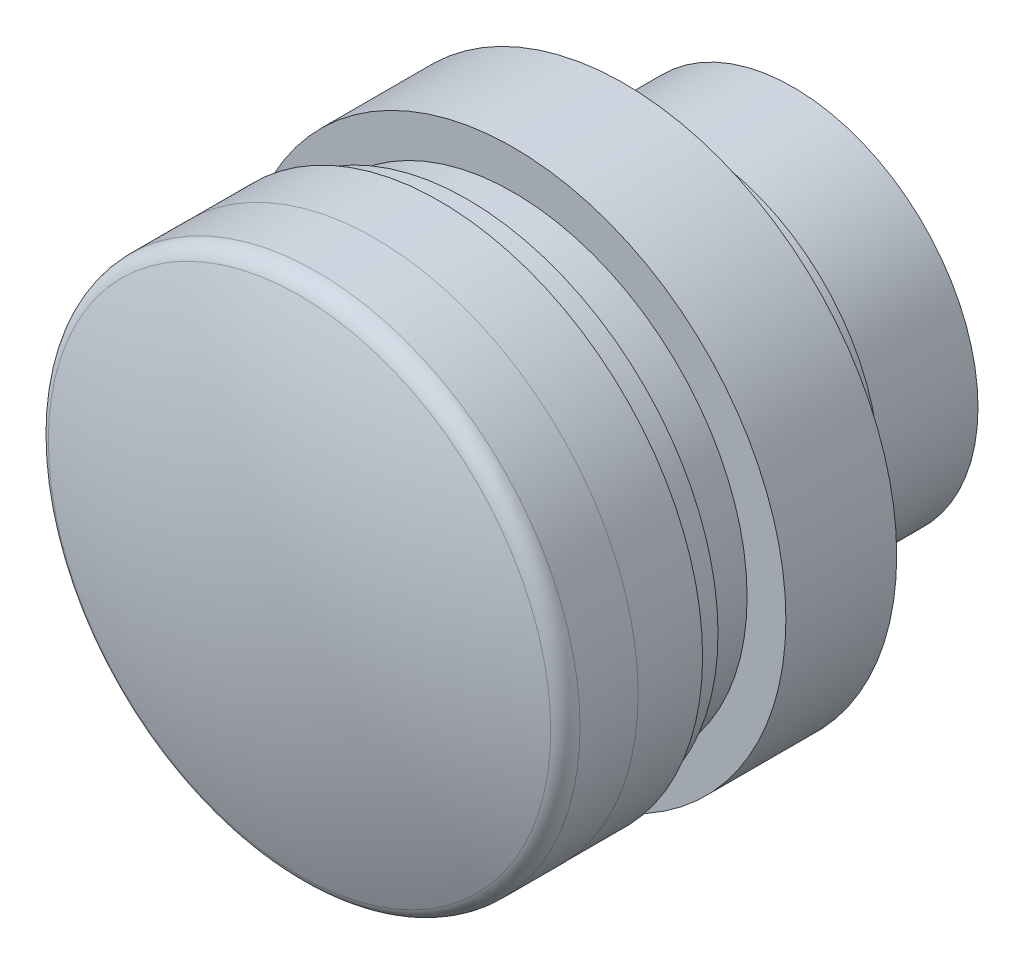
ISO-10303-21;
HEADER;
FILE_DESCRIPTION(('STEP AP214'),'2;1');
FILE_NAME('part.step','',(''),(''),'','','');
FILE_SCHEMA(('AUTOMOTIVE_DESIGN { 1 0 10303 214 1 1 1 1 }'));
ENDSEC;
DATA;
#1=APPLICATION_CONTEXT('core data for automotive mechanical design processes');
#2=APPLICATION_PROTOCOL_DEFINITION('international standard','automotive_design',2000,#1);
#3=PRODUCT_CONTEXT('',#1,'mechanical');
#4=PRODUCT('Part','Part','',(#3));
#5=PRODUCT_RELATED_PRODUCT_CATEGORY('part','',(#4));
#6=PRODUCT_DEFINITION_FORMATION('','',#4);
#7=PRODUCT_DEFINITION_CONTEXT('part definition',#1,'design');
#8=PRODUCT_DEFINITION('design','',#6,#7);
#9=PRODUCT_DEFINITION_SHAPE('','',#8);
#10=(LENGTH_UNIT() NAMED_UNIT(*) SI_UNIT(.MILLI.,.METRE.));
#11=(NAMED_UNIT(*) PLANE_ANGLE_UNIT() SI_UNIT($,.RADIAN.));
#12=(NAMED_UNIT(*) SI_UNIT($,.STERADIAN.) SOLID_ANGLE_UNIT());
#13=UNCERTAINTY_MEASURE_WITH_UNIT(LENGTH_MEASURE(1.E-05),#10,'distance_accuracy_value','');
#14=(GEOMETRIC_REPRESENTATION_CONTEXT(3) GLOBAL_UNCERTAINTY_ASSIGNED_CONTEXT((#13)) GLOBAL_UNIT_ASSIGNED_CONTEXT((#10,
#11,#12)) REPRESENTATION_CONTEXT('',''));
#15=CARTESIAN_POINT('',(0.,0.,0.));
#16=DIRECTION('',(0.,0.,1.));
#17=DIRECTION('',(1.,0.,0.));
#18=AXIS2_PLACEMENT_3D('',#15,#16,#17);
#19=CARTESIAN_POINT('',(-23.4333994970576,22.46431816646,16.3542236248212));
#20=DIRECTION('',(0.845217444090137,0.0154176098501558,0.534200121220731));
#21=DIRECTION('',(0.131295162145007,-0.974938884779345,-0.179598862308542));
#22=AXIS2_PLACEMENT_3D('',#19,#20,#21);
#23=SPHERICAL_SURFACE('',#22,38.6877536315113);
#24=CARTESIAN_POINT('',(-23.4333994970576,22.46431816646,52.5723338084599));
#25=DIRECTION('',(0.,0.,-1.));
#26=DIRECTION('',(-1.,0.,0.));
#27=AXIS2_PLACEMENT_3D('',#24,#25,#26);
#28=CIRCLE('',#27,13.6011314153758);
#29=CARTESIAN_POINT('',(-37.0345309124334,22.46431816646,52.5723338084599));
#30=VERTEX_POINT('',#29);
#31=EDGE_CURVE('E64',#30,#30,#28,.T.);
#32=ORIENTED_EDGE('',*,*,#31,.F.);
#33=EDGE_LOOP('',(#32));
#34=FACE_BOUND('',#33,.T.);
#35=ADVANCED_FACE('F14',(#34),#23,.T.);
#36=CARTESIAN_POINT('',(-23.4333994970576,22.46431816646,51.6359133009997));
#37=DIRECTION('',(0.,0.,-1.));
#38=DIRECTION('',(-1.,0.,0.));
#39=AXIS2_PLACEMENT_3D('',#36,#37,#38);
#40=TOROIDAL_SURFACE('',#39,13.2494737487538,1.00027320332298);
#41=CARTESIAN_POINT('',(-23.4333994970576,22.46431816646,51.6359133009997));
#42=DIRECTION('',(0.,0.,1.));
#43=DIRECTION('',(1.,0.,0.));
#44=AXIS2_PLACEMENT_3D('',#41,#42,#43);
#45=CIRCLE('',#44,14.2497469520767);
#46=CARTESIAN_POINT('',(-9.18365254498091,22.46431816646,51.6359133009997));
#47=VERTEX_POINT('',#46);
#48=EDGE_CURVE('E63',#47,#47,#45,.F.);
#49=ORIENTED_EDGE('',*,*,#48,.F.);
#50=EDGE_LOOP('',(#49));
#51=FACE_BOUND('',#50,.T.);
#52=ORIENTED_EDGE('',*,*,#31,.T.);
#53=EDGE_LOOP('',(#52));
#54=FACE_BOUND('',#53,.T.);
#55=ADVANCED_FACE('F73',(#51,#54),#40,.T.);
#56=CARTESIAN_POINT('',(-23.4333994970576,22.46431816646,34.991889066));
#57=DIRECTION('',(0.,0.,1.));
#58=DIRECTION('',(1.,0.,0.));
#59=AXIS2_PLACEMENT_3D('',#56,#57,#58);
#60=CYLINDRICAL_SURFACE('',#59,14.2497469520767);
#61=CARTESIAN_POINT('',(-23.4333994970576,22.46431816646,48.4918890659998));
#62=DIRECTION('',(0.,0.,1.));
#63=DIRECTION('',(1.,0.,0.));
#64=AXIS2_PLACEMENT_3D('',#61,#62,#63);
#65=CIRCLE('',#64,14.2497469520767);
#66=CARTESIAN_POINT('',(-9.18365254498091,22.46431816646,48.4918890659998));
#67=VERTEX_POINT('',#66);
#68=EDGE_CURVE('E61',#67,#67,#65,.F.);
#69=ORIENTED_EDGE('',*,*,#68,.F.);
#70=EDGE_LOOP('',(#69));
#71=FACE_BOUND('',#70,.T.);
#72=ORIENTED_EDGE('',*,*,#48,.T.);
#73=EDGE_LOOP('',(#72));
#74=FACE_BOUND('',#73,.T.);
#75=ADVANCED_FACE('F76',(#71,#74),#60,.T.);
#76=CARTESIAN_POINT('',(-23.4333994970576,36.705149740877,48.4918890659998));
#77=DIRECTION('',(0.,0.,-1.));
#78=DIRECTION('',(-1.,0.,0.));
#79=AXIS2_PLACEMENT_3D('',#76,#77,#78);
#80=PLANE('',#79);
#81=CARTESIAN_POINT('',(-23.4333994970576,22.46431816646,48.4918890659998));
#82=DIRECTION('',(0.,0.,1.));
#83=DIRECTION('',(1.,0.,0.));
#84=AXIS2_PLACEMENT_3D('',#81,#82,#83);
#85=CIRCLE('',#84,14.240831574417);
#86=CARTESIAN_POINT('',(-9.19256792264061,22.46431816646,48.4918890659998));
#87=VERTEX_POINT('',#86);
#88=EDGE_CURVE('E58',#87,#87,#85,.F.);
#89=ORIENTED_EDGE('',*,*,#88,.F.);
#90=EDGE_LOOP('',(#89));
#91=FACE_BOUND('',#90,.T.);
#92=ORIENTED_EDGE('',*,*,#68,.T.);
#93=EDGE_LOOP('',(#92));
#94=FACE_BOUND('',#93,.T.);
#95=ADVANCED_FACE('F80',(#91,#94),#80,.T.);
#96=CARTESIAN_POINT('',(-23.4333994970576,22.46431816646,34.991889066));
#97=DIRECTION('',(0.,0.,1.));
#98=DIRECTION('',(1.,0.,0.));
#99=AXIS2_PLACEMENT_3D('',#96,#97,#98);
#100=CYLINDRICAL_SURFACE('',#99,14.240831574417);
#101=CARTESIAN_POINT('',(-23.4333994970576,22.46431816646,44.9918890659999));
#102=DIRECTION('',(0.,0.,1.));
#103=DIRECTION('',(1.,0.,0.));
#104=AXIS2_PLACEMENT_3D('',#101,#102,#103);
#105=CIRCLE('',#104,14.240831574417);
#106=CARTESIAN_POINT('',(-9.1925679226406,22.46431816646,44.9918890659999));
#107=VERTEX_POINT('',#106);
#108=EDGE_CURVE('E55',#107,#107,#105,.F.);
#109=ORIENTED_EDGE('',*,*,#108,.F.);
#110=EDGE_LOOP('',(#109));
#111=FACE_BOUND('',#110,.T.);
#112=ORIENTED_EDGE('',*,*,#88,.T.);
#113=EDGE_LOOP('',(#112));
#114=FACE_BOUND('',#113,.T.);
#115=ADVANCED_FACE('F84',(#111,#114),#100,.T.);
#116=CARTESIAN_POINT('',(-23.4333994970576,36.0390771050173,44.991889066));
#117=DIRECTION('',(0.,0.,-1.));
#118=DIRECTION('',(-1.,0.,0.));
#119=AXIS2_PLACEMENT_3D('',#116,#117,#118);
#120=PLANE('',#119);
#121=CARTESIAN_POINT('',(-23.4333994970576,22.46431816646,44.991889066));
#122=DIRECTION('',(0.,0.,1.));
#123=DIRECTION('',(1.,0.,0.));
#124=AXIS2_PLACEMENT_3D('',#121,#122,#123);
#125=CIRCLE('',#124,13.5747589385573);
#126=CARTESIAN_POINT('',(-9.8586405585003,22.46431816646,44.991889066));
#127=VERTEX_POINT('',#126);
#128=EDGE_CURVE('E52',#127,#127,#125,.F.);
#129=ORIENTED_EDGE('',*,*,#128,.F.);
#130=EDGE_LOOP('',(#129));
#131=FACE_BOUND('',#130,.T.);
#132=ORIENTED_EDGE('',*,*,#108,.T.);
#133=EDGE_LOOP('',(#132));
#134=FACE_BOUND('',#133,.T.);
#135=ADVANCED_FACE('F88',(#131,#134),#120,.T.);
#136=CARTESIAN_POINT('',(-23.4333994970576,22.46431816646,34.991889066));
#137=DIRECTION('',(0.,0.,1.));
#138=DIRECTION('',(1.,0.,0.));
#139=AXIS2_PLACEMENT_3D('',#136,#137,#138);
#140=CYLINDRICAL_SURFACE('',#139,13.5747589385573);
#141=CARTESIAN_POINT('',(-23.4333994970576,22.46431816646,43.491889066));
#142=DIRECTION('',(0.,0.,1.));
#143=DIRECTION('',(1.,0.,0.));
#144=AXIS2_PLACEMENT_3D('',#141,#142,#143);
#145=CIRCLE('',#144,13.5747589385573);
#146=CARTESIAN_POINT('',(-9.8586405585003,22.46431816646,43.491889066));
#147=VERTEX_POINT('',#146);
#148=EDGE_CURVE('E49',#147,#147,#145,.F.);
#149=ORIENTED_EDGE('',*,*,#148,.F.);
#150=EDGE_LOOP('',(#149));
#151=FACE_BOUND('',#150,.T.);
#152=ORIENTED_EDGE('',*,*,#128,.T.);
#153=EDGE_LOOP('',(#152));
#154=FACE_BOUND('',#153,.T.);
#155=ADVANCED_FACE('F92',(#151,#154),#140,.T.);
#156=CARTESIAN_POINT('',(-23.4333994970576,35.11431816646,43.491889066));
#157=DIRECTION('',(0.,0.,-1.));
#158=DIRECTION('',(-1.,0.,0.));
#159=AXIS2_PLACEMENT_3D('',#156,#157,#158);
#160=PLANE('',#159);
#161=CARTESIAN_POINT('',(-23.4333994970576,22.46431816646,43.491889066));
#162=DIRECTION('',(0.,0.,1.));
#163=DIRECTION('',(1.,0.,0.));
#164=AXIS2_PLACEMENT_3D('',#161,#162,#163);
#165=CIRCLE('',#164,12.65);
#166=CARTESIAN_POINT('',(-10.7833994970576,22.46431816646,43.491889066));
#167=VERTEX_POINT('',#166);
#168=EDGE_CURVE('E46',#167,#167,#165,.F.);
#169=ORIENTED_EDGE('',*,*,#168,.F.);
#170=EDGE_LOOP('',(#169));
#171=FACE_BOUND('',#170,.T.);
#172=ORIENTED_EDGE('',*,*,#148,.T.);
#173=EDGE_LOOP('',(#172));
#174=FACE_BOUND('',#173,.T.);
#175=ADVANCED_FACE('F96',(#171,#174),#160,.T.);
#176=CARTESIAN_POINT('',(-23.4333994970576,22.46431816646,25.8418890660008));
#177=DIRECTION('',(0.,0.,-1.));
#178=DIRECTION('',(-1.,0.,0.));
#179=AXIS2_PLACEMENT_3D('',#176,#177,#178);
#180=PLANE('',#179);
#181=CARTESIAN_POINT('',(-23.4333994970576,22.46431816646,25.8418890660007));
#182=DIRECTION('',(0.,0.,1.));
#183=DIRECTION('',(1.,0.,0.));
#184=AXIS2_PLACEMENT_3D('',#181,#182,#183);
#185=CIRCLE('',#184,9.99982242251);
#186=CARTESIAN_POINT('',(-13.4335770745476,22.46431816646,25.8418890660007));
#187=VERTEX_POINT('',#186);
#188=EDGE_CURVE('E43',#187,#187,#185,.T.);
#189=ORIENTED_EDGE('',*,*,#188,.F.);
#190=EDGE_LOOP('',(#189));
#191=FACE_BOUND('',#190,.T.);
#192=ADVANCED_FACE('F100',(#191),#180,.T.);
#193=CARTESIAN_POINT('',(-23.4333994970576,22.46431816646,34.991889066));
#194=DIRECTION('',(0.,0.,1.));
#195=DIRECTION('',(1.,0.,0.));
#196=AXIS2_PLACEMENT_3D('',#193,#194,#195);
#197=CYLINDRICAL_SURFACE('',#196,12.65);
#198=CARTESIAN_POINT('',(-23.4333994970576,22.46431816646,40.991889066));
#199=DIRECTION('',(0.,0.,1.));
#200=DIRECTION('',(1.,0.,0.));
#201=AXIS2_PLACEMENT_3D('',#198,#199,#200);
#202=CIRCLE('',#201,12.65);
#203=CARTESIAN_POINT('',(-10.7833994970576,22.46431816646,40.991889066));
#204=VERTEX_POINT('',#203);
#205=EDGE_CURVE('E40',#204,#204,#202,.F.);
#206=ORIENTED_EDGE('',*,*,#205,.F.);
#207=EDGE_LOOP('',(#206));
#208=FACE_BOUND('',#207,.T.);
#209=ORIENTED_EDGE('',*,*,#168,.T.);
#210=EDGE_LOOP('',(#209));
#211=FACE_BOUND('',#210,.T.);
#212=ADVANCED_FACE('F104',(#208,#211),#197,.T.);
#213=CARTESIAN_POINT('',(-23.4333994970576,22.46431816646,34.991889066));
#214=DIRECTION('',(0.,0.,1.));
#215=DIRECTION('',(1.,0.,0.));
#216=AXIS2_PLACEMENT_3D('',#213,#214,#215);
#217=CYLINDRICAL_SURFACE('',#216,9.99982242251);
#218=ORIENTED_EDGE('',*,*,#188,.T.);
#219=EDGE_LOOP('',(#218));
#220=FACE_BOUND('',#219,.T.);
#221=CARTESIAN_POINT('',(-23.4333994970576,22.46431816646,31.3413052282605));
#222=DIRECTION('',(0.,0.,1.));
#223=DIRECTION('',(1.,0.,0.));
#224=AXIS2_PLACEMENT_3D('',#221,#222,#223);
#225=CIRCLE('',#224,9.99982242251);
#226=CARTESIAN_POINT('',(-13.4335770745476,22.46431816646,31.3413052282605));
#227=VERTEX_POINT('',#226);
#228=EDGE_CURVE('E37',#227,#227,#225,.T.);
#229=ORIENTED_EDGE('',*,*,#228,.F.);
#230=EDGE_LOOP('',(#229));
#231=FACE_BOUND('',#230,.T.);
#232=ADVANCED_FACE('F108',(#220,#231),#217,.T.);
#233=CARTESIAN_POINT('',(-23.4333994970576,37.21431816646,40.991889066));
#234=DIRECTION('',(0.,0.,1.));
#235=DIRECTION('',(0.,-1.,0.));
#236=AXIS2_PLACEMENT_3D('',#233,#234,#235);
#237=PLANE('',#236);
#238=CARTESIAN_POINT('',(-23.4333994970576,22.46431816646,40.991889066));
#239=DIRECTION('',(0.,0.,1.));
#240=DIRECTION('',(1.,0.,0.));
#241=AXIS2_PLACEMENT_3D('',#238,#239,#240);
#242=CIRCLE('',#241,14.75);
#243=CARTESIAN_POINT('',(-8.6833994970576,22.46431816646,40.991889066));
#244=VERTEX_POINT('',#243);
#245=EDGE_CURVE('E34',#244,#244,#242,.F.);
#246=ORIENTED_EDGE('',*,*,#245,.F.);
#247=EDGE_LOOP('',(#246));
#248=FACE_BOUND('',#247,.T.);
#249=ORIENTED_EDGE('',*,*,#205,.T.);
#250=EDGE_LOOP('',(#249));
#251=FACE_BOUND('',#250,.T.);
#252=ADVANCED_FACE('F112',(#248,#251),#237,.T.);
#253=CARTESIAN_POINT('',(-23.4333994970576,32.46414058897,31.3413052282605));
#254=DIRECTION('',(0.,0.,-1.));
#255=DIRECTION('',(-1.,0.,0.));
#256=AXIS2_PLACEMENT_3D('',#253,#254,#255);
#257=PLANE('',#256);
#258=ORIENTED_EDGE('',*,*,#228,.T.);
#259=EDGE_LOOP('',(#258));
#260=FACE_BOUND('',#259,.T.);
#261=CARTESIAN_POINT('',(-23.4333994970576,22.46431816646,31.3413052282605));
#262=DIRECTION('',(0.,0.,1.));
#263=DIRECTION('',(1.,0.,0.));
#264=AXIS2_PLACEMENT_3D('',#261,#262,#263);
#265=CIRCLE('',#264,10.1272600685867);
#266=CARTESIAN_POINT('',(-13.3061394284709,22.46431816646,31.3413052282605));
#267=VERTEX_POINT('',#266);
#268=EDGE_CURVE('E27',#267,#267,#265,.T.);
#269=ORIENTED_EDGE('',*,*,#268,.F.);
#270=EDGE_LOOP('',(#269));
#271=FACE_BOUND('',#270,.T.);
#272=ADVANCED_FACE('F116',(#260,#271),#257,.T.);
#273=CARTESIAN_POINT('',(-23.4333994970576,22.46431816646,34.991889066));
#274=DIRECTION('',(0.,0.,1.));
#275=DIRECTION('',(1.,0.,0.));
#276=AXIS2_PLACEMENT_3D('',#273,#274,#275);
#277=CYLINDRICAL_SURFACE('',#276,14.75);
#278=CARTESIAN_POINT('',(-23.4333994970576,22.46431816646,34.991889066));
#279=DIRECTION('',(0.,0.,1.));
#280=DIRECTION('',(1.,0.,0.));
#281=AXIS2_PLACEMENT_3D('',#278,#279,#280);
#282=CIRCLE('',#281,14.75);
#283=CARTESIAN_POINT('',(-8.6833994970576,22.46431816646,34.991889066));
#284=VERTEX_POINT('',#283);
#285=EDGE_CURVE('E22',#284,#284,#282,.F.);
#286=ORIENTED_EDGE('',*,*,#285,.F.);
#287=EDGE_LOOP('',(#286));
#288=FACE_BOUND('',#287,.T.);
#289=ORIENTED_EDGE('',*,*,#245,.T.);
#290=EDGE_LOOP('',(#289));
#291=FACE_BOUND('',#290,.T.);
#292=ADVANCED_FACE('F120',(#288,#291),#277,.T.);
#293=CARTESIAN_POINT('',(-23.4333994970576,22.46431816646,34.991889066));
#294=DIRECTION('',(0.,0.,1.));
#295=DIRECTION('',(1.,0.,0.));
#296=AXIS2_PLACEMENT_3D('',#293,#294,#295);
#297=CYLINDRICAL_SURFACE('',#296,10.1272600685867);
#298=ORIENTED_EDGE('',*,*,#268,.T.);
#299=EDGE_LOOP('',(#298));
#300=FACE_BOUND('',#299,.T.);
#301=CARTESIAN_POINT('',(-23.4333994970576,22.46431816646,34.991889066));
#302=DIRECTION('',(0.,0.,1.));
#303=DIRECTION('',(1.,0.,0.));
#304=AXIS2_PLACEMENT_3D('',#301,#302,#303);
#305=CIRCLE('',#304,10.1272600685867);
#306=CARTESIAN_POINT('',(-13.3061394284709,22.46431816646,34.991889066));
#307=VERTEX_POINT('',#306);
#308=EDGE_CURVE('E10',#307,#307,#305,.T.);
#309=ORIENTED_EDGE('',*,*,#308,.F.);
#310=EDGE_LOOP('',(#309));
#311=FACE_BOUND('',#310,.T.);
#312=ADVANCED_FACE('F124',(#300,#311),#297,.T.);
#313=CARTESIAN_POINT('',(-23.4333994970576,32.5915782350467,34.991889066));
#314=DIRECTION('',(0.,0.,-1.));
#315=DIRECTION('',(-1.,0.,0.));
#316=AXIS2_PLACEMENT_3D('',#313,#314,#315);
#317=PLANE('',#316);
#318=ORIENTED_EDGE('',*,*,#308,.T.);
#319=EDGE_LOOP('',(#318));
#320=FACE_BOUND('',#319,.T.);
#321=ORIENTED_EDGE('',*,*,#285,.T.);
#322=EDGE_LOOP('',(#321));
#323=FACE_BOUND('',#322,.T.);
#324=ADVANCED_FACE('F128',(#320,#323),#317,.T.);
#325=CLOSED_SHELL('',(#35,#55,#75,#95,#115,#135,#155,#175,#192,#212,#232,#252,#272,#292,#312,#324));
#326=MANIFOLD_SOLID_BREP('B1',#325);
#327=ADVANCED_BREP_SHAPE_REPRESENTATION('',(#18,#326),#14);
#328=SHAPE_DEFINITION_REPRESENTATION(#9,#327);
ENDSEC;
END-ISO-10303-21;
